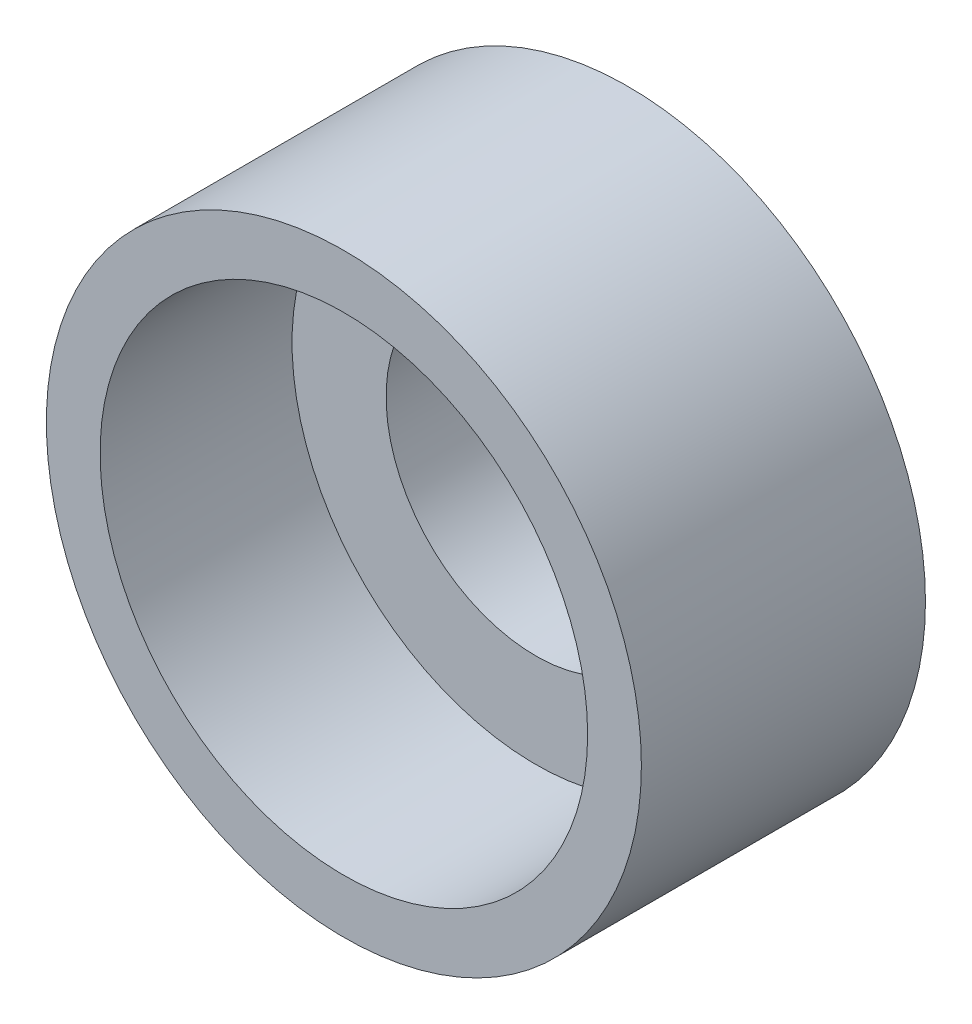
ISO-10303-21;
HEADER;
FILE_DESCRIPTION(('STEP AP214'),'2;1');
FILE_NAME('part.step','',(''),(''),'','','');
FILE_SCHEMA(('AUTOMOTIVE_DESIGN { 1 0 10303 214 1 1 1 1 }'));
ENDSEC;
DATA;
#1=APPLICATION_CONTEXT('core data for automotive mechanical design processes');
#2=APPLICATION_PROTOCOL_DEFINITION('international standard','automotive_design',2000,#1);
#3=PRODUCT_CONTEXT('',#1,'mechanical');
#4=PRODUCT('Part','Part','',(#3));
#5=PRODUCT_RELATED_PRODUCT_CATEGORY('part','',(#4));
#6=PRODUCT_DEFINITION_FORMATION('','',#4);
#7=PRODUCT_DEFINITION_CONTEXT('part definition',#1,'design');
#8=PRODUCT_DEFINITION('design','',#6,#7);
#9=PRODUCT_DEFINITION_SHAPE('','',#8);
#10=(LENGTH_UNIT() NAMED_UNIT(*) SI_UNIT(.MILLI.,.METRE.));
#11=(NAMED_UNIT(*) PLANE_ANGLE_UNIT() SI_UNIT($,.RADIAN.));
#12=(NAMED_UNIT(*) SI_UNIT($,.STERADIAN.) SOLID_ANGLE_UNIT());
#13=UNCERTAINTY_MEASURE_WITH_UNIT(LENGTH_MEASURE(1.E-05),#10,'distance_accuracy_value','');
#14=(GEOMETRIC_REPRESENTATION_CONTEXT(3) GLOBAL_UNCERTAINTY_ASSIGNED_CONTEXT((#13)) GLOBAL_UNIT_ASSIGNED_CONTEXT((#10,
#11,#12)) REPRESENTATION_CONTEXT('',''));
#15=CARTESIAN_POINT('',(0.,0.,0.));
#16=DIRECTION('',(0.,0.,1.));
#17=DIRECTION('',(1.,0.,0.));
#18=AXIS2_PLACEMENT_3D('',#15,#16,#17);
#19=CARTESIAN_POINT('',(0.,0.,1.2));
#20=DIRECTION('',(0.,0.,1.));
#21=DIRECTION('',(1.,0.,0.));
#22=AXIS2_PLACEMENT_3D('',#19,#20,#21);
#23=PLANE('',#22);
#24=CARTESIAN_POINT('',(0.,0.,1.2));
#25=DIRECTION('',(0.,0.,1.));
#26=DIRECTION('',(1.,0.,0.));
#27=AXIS2_PLACEMENT_3D('',#24,#25,#26);
#28=CIRCLE('',#27,1.95);
#29=CARTESIAN_POINT('',(1.95,0.,1.2));
#30=VERTEX_POINT('',#29);
#31=EDGE_CURVE('E56',#30,#30,#28,.T.);
#32=ORIENTED_EDGE('',*,*,#31,.F.);
#33=EDGE_LOOP('',(#32));
#34=FACE_BOUND('',#33,.T.);
#35=CARTESIAN_POINT('',(0.,0.,1.2));
#36=DIRECTION('',(0.,0.,1.));
#37=DIRECTION('',(1.,0.,0.));
#38=AXIS2_PLACEMENT_3D('',#35,#36,#37);
#39=CIRCLE('',#38,3.175);
#40=CARTESIAN_POINT('',(3.175,0.,1.2));
#41=VERTEX_POINT('',#40);
#42=EDGE_CURVE('E10',#41,#41,#39,.F.);
#43=ORIENTED_EDGE('',*,*,#42,.F.);
#44=EDGE_LOOP('',(#43));
#45=FACE_BOUND('',#44,.T.);
#46=ADVANCED_FACE('F43',(#34,#45),#23,.T.);
#47=CARTESIAN_POINT('',(0.,0.,0.));
#48=DIRECTION('',(0.,0.,1.));
#49=DIRECTION('',(1.,0.,0.));
#50=AXIS2_PLACEMENT_3D('',#47,#48,#49);
#51=PLANE('',#50);
#52=CARTESIAN_POINT('',(0.,0.,0.));
#53=DIRECTION('',(0.,0.,1.));
#54=DIRECTION('',(1.,0.,0.));
#55=AXIS2_PLACEMENT_3D('',#52,#53,#54);
#56=CIRCLE('',#55,3.875);
#57=CARTESIAN_POINT('',(3.875,0.,0.));
#58=VERTEX_POINT('',#57);
#59=EDGE_CURVE('E51',#58,#58,#56,.T.);
#60=ORIENTED_EDGE('',*,*,#59,.F.);
#61=EDGE_LOOP('',(#60));
#62=FACE_BOUND('',#61,.T.);
#63=CARTESIAN_POINT('',(0.,0.,0.));
#64=DIRECTION('',(0.,0.,1.));
#65=DIRECTION('',(1.,0.,0.));
#66=AXIS2_PLACEMENT_3D('',#63,#64,#65);
#67=CIRCLE('',#66,1.95);
#68=CARTESIAN_POINT('',(1.95,0.,0.));
#69=VERTEX_POINT('',#68);
#70=EDGE_CURVE('E61',#69,#69,#67,.T.);
#71=ORIENTED_EDGE('',*,*,#70,.T.);
#72=EDGE_LOOP('',(#71));
#73=FACE_BOUND('',#72,.T.);
#74=ADVANCED_FACE('F92',(#62,#73),#51,.F.);
#75=CARTESIAN_POINT('',(0.,0.,1.2));
#76=DIRECTION('',(0.,0.,-1.));
#77=DIRECTION('',(-1.,0.,0.));
#78=AXIS2_PLACEMENT_3D('',#75,#76,#77);
#79=CYLINDRICAL_SURFACE('',#78,3.875);
#80=ORIENTED_EDGE('',*,*,#59,.T.);
#81=EDGE_LOOP('',(#80));
#82=FACE_BOUND('',#81,.T.);
#83=CARTESIAN_POINT('',(0.,0.,3.7));
#84=DIRECTION('',(0.,0.,1.));
#85=DIRECTION('',(1.,0.,0.));
#86=AXIS2_PLACEMENT_3D('',#83,#84,#85);
#87=CIRCLE('',#86,3.875);
#88=CARTESIAN_POINT('',(3.875,0.,3.7));
#89=VERTEX_POINT('',#88);
#90=EDGE_CURVE('E66',#89,#89,#87,.T.);
#91=ORIENTED_EDGE('',*,*,#90,.F.);
#92=EDGE_LOOP('',(#91));
#93=FACE_BOUND('',#92,.T.);
#94=ADVANCED_FACE('F45',(#82,#93),#79,.T.);
#95=CARTESIAN_POINT('',(0.,0.,1.2));
#96=DIRECTION('',(0.,0.,-1.));
#97=DIRECTION('',(-1.,0.,0.));
#98=AXIS2_PLACEMENT_3D('',#95,#96,#97);
#99=CYLINDRICAL_SURFACE('',#98,1.95);
#100=ORIENTED_EDGE('',*,*,#31,.T.);
#101=EDGE_LOOP('',(#100));
#102=FACE_BOUND('',#101,.T.);
#103=ORIENTED_EDGE('',*,*,#70,.F.);
#104=EDGE_LOOP('',(#103));
#105=FACE_BOUND('',#104,.T.);
#106=ADVANCED_FACE('F80',(#102,#105),#99,.F.);
#107=CARTESIAN_POINT('',(0.,0.,3.7));
#108=DIRECTION('',(0.,0.,1.));
#109=DIRECTION('',(1.,0.,0.));
#110=AXIS2_PLACEMENT_3D('',#107,#108,#109);
#111=PLANE('',#110);
#112=ORIENTED_EDGE('',*,*,#90,.T.);
#113=EDGE_LOOP('',(#112));
#114=FACE_BOUND('',#113,.T.);
#115=CARTESIAN_POINT('',(0.,0.,3.7));
#116=DIRECTION('',(0.,0.,1.));
#117=DIRECTION('',(1.,0.,0.));
#118=AXIS2_PLACEMENT_3D('',#115,#116,#117);
#119=CIRCLE('',#118,3.175);
#120=CARTESIAN_POINT('',(3.175,0.,3.7));
#121=VERTEX_POINT('',#120);
#122=EDGE_CURVE('E71',#121,#121,#119,.T.);
#123=ORIENTED_EDGE('',*,*,#122,.F.);
#124=EDGE_LOOP('',(#123));
#125=FACE_BOUND('',#124,.T.);
#126=ADVANCED_FACE('F78',(#114,#125),#111,.T.);
#127=CARTESIAN_POINT('',(0.,0.,3.7));
#128=DIRECTION('',(0.,0.,-1.));
#129=DIRECTION('',(-1.,0.,0.));
#130=AXIS2_PLACEMENT_3D('',#127,#128,#129);
#131=CYLINDRICAL_SURFACE('',#130,3.175);
#132=ORIENTED_EDGE('',*,*,#122,.T.);
#133=EDGE_LOOP('',(#132));
#134=FACE_BOUND('',#133,.T.);
#135=ORIENTED_EDGE('',*,*,#42,.T.);
#136=EDGE_LOOP('',(#135));
#137=FACE_BOUND('',#136,.T.);
#138=ADVANCED_FACE('F76',(#134,#137),#131,.F.);
#139=CLOSED_SHELL('',(#46,#74,#94,#106,#126,#138));
#140=MANIFOLD_SOLID_BREP('B2',#139);
#141=ADVANCED_BREP_SHAPE_REPRESENTATION('',(#18,#140),#14);
#142=SHAPE_DEFINITION_REPRESENTATION(#9,#141);
ENDSEC;
END-ISO-10303-21;
